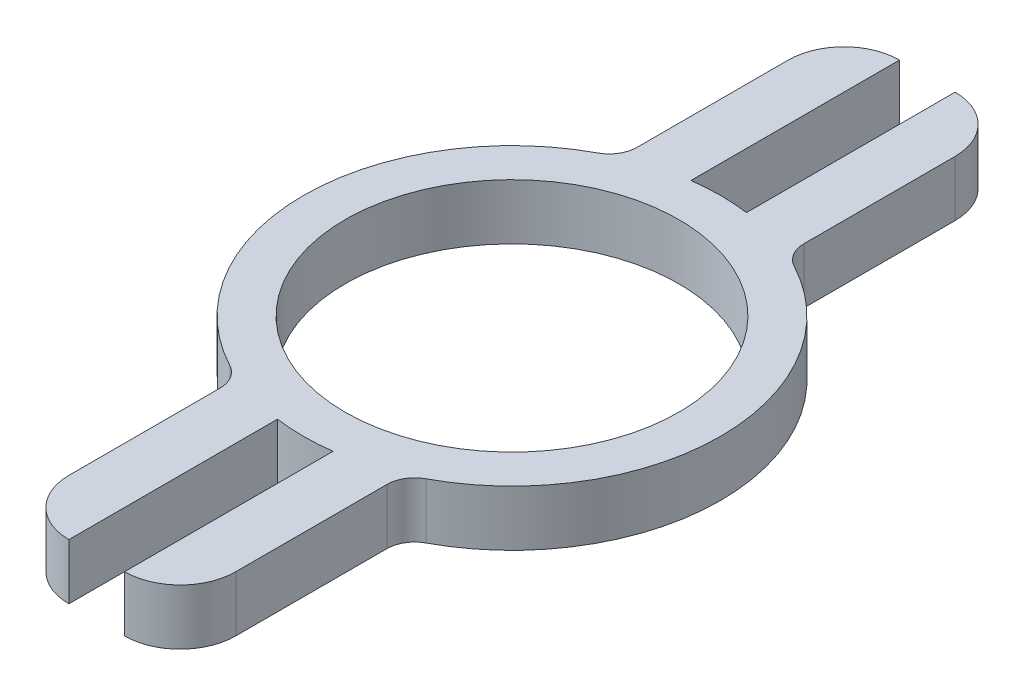
ISO-10303-21;
HEADER;
FILE_DESCRIPTION(('STEP AP214'),'2;1');
FILE_NAME('part.step','',(''),(''),'','','');
FILE_SCHEMA(('AUTOMOTIVE_DESIGN { 1 0 10303 214 1 1 1 1 }'));
ENDSEC;
DATA;
#1=APPLICATION_CONTEXT('core data for automotive mechanical design processes');
#2=APPLICATION_PROTOCOL_DEFINITION('international standard','automotive_design',2000,#1);
#3=PRODUCT_CONTEXT('',#1,'mechanical');
#4=PRODUCT('Part','Part','',(#3));
#5=PRODUCT_RELATED_PRODUCT_CATEGORY('part','',(#4));
#6=PRODUCT_DEFINITION_FORMATION('','',#4);
#7=PRODUCT_DEFINITION_CONTEXT('part definition',#1,'design');
#8=PRODUCT_DEFINITION('design','',#6,#7);
#9=PRODUCT_DEFINITION_SHAPE('','',#8);
#10=(LENGTH_UNIT() NAMED_UNIT(*) SI_UNIT(.MILLI.,.METRE.));
#11=(NAMED_UNIT(*) PLANE_ANGLE_UNIT() SI_UNIT($,.RADIAN.));
#12=(NAMED_UNIT(*) SI_UNIT($,.STERADIAN.) SOLID_ANGLE_UNIT());
#13=UNCERTAINTY_MEASURE_WITH_UNIT(LENGTH_MEASURE(1.E-05),#10,'distance_accuracy_value','');
#14=(GEOMETRIC_REPRESENTATION_CONTEXT(3) GLOBAL_UNCERTAINTY_ASSIGNED_CONTEXT((#13)) GLOBAL_UNIT_ASSIGNED_CONTEXT((#10,
#11,#12)) REPRESENTATION_CONTEXT('',''));
#15=CARTESIAN_POINT('',(0.,0.,0.));
#16=DIRECTION('',(0.,0.,1.));
#17=DIRECTION('',(1.,0.,0.));
#18=AXIS2_PLACEMENT_3D('',#15,#16,#17);
#19=CARTESIAN_POINT('',(-40.,20.,75.));
#20=DIRECTION('',(0.,-1.,0.));
#21=DIRECTION('',(0.,0.,-1.));
#22=AXIS2_PLACEMENT_3D('',#19,#20,#21);
#23=CYLINDRICAL_SURFACE('',#22,10.);
#24=DIRECTION('',(0.,-1.,0.));
#25=VECTOR('',#24,1.);
#26=CARTESIAN_POINT('',(-30.,-20.,75.));
#27=LINE('',#26,#25);
#28=CARTESIAN_POINT('',(-30.,0.,75.0000000000001));
#29=VERTEX_POINT('',#28);
#30=CARTESIAN_POINT('',(-30.,-20.,75.0000000000001));
#31=VERTEX_POINT('',#30);
#32=EDGE_CURVE('E365',#29,#31,#27,.T.);
#33=ORIENTED_EDGE('',*,*,#32,.F.);
#34=CARTESIAN_POINT('',(-40.,0.,75.));
#35=DIRECTION('',(0.,1.,0.));
#36=DIRECTION('',(0.,0.,1.));
#37=AXIS2_PLACEMENT_3D('',#34,#35,#36);
#38=CIRCLE('',#37,10.);
#39=CARTESIAN_POINT('',(-35.2941176470588,0.,66.1764705882353));
#40=VERTEX_POINT('',#39);
#41=EDGE_CURVE('E55',#29,#40,#38,.T.);
#42=ORIENTED_EDGE('',*,*,#41,.T.);
#43=DIRECTION('',(0.,-1.,0.));
#44=VECTOR('',#43,1.);
#45=CARTESIAN_POINT('',(-35.2941176470588,20.,66.1764705882353));
#46=LINE('',#45,#44);
#47=CARTESIAN_POINT('',(-35.2941176470589,-20.,66.1764705882353));
#48=VERTEX_POINT('',#47);
#49=EDGE_CURVE('E369',#48,#40,#46,.F.);
#50=ORIENTED_EDGE('',*,*,#49,.F.);
#51=CARTESIAN_POINT('',(-40.,-20.,75.));
#52=DIRECTION('',(0.,-1.,0.));
#53=DIRECTION('',(0.,0.,-1.));
#54=AXIS2_PLACEMENT_3D('',#51,#52,#53);
#55=CIRCLE('',#54,10.);
#56=EDGE_CURVE('E11',#48,#31,#55,.T.);
#57=ORIENTED_EDGE('',*,*,#56,.T.);
#58=EDGE_LOOP('',(#33,#42,#50,#57));
#59=FACE_BOUND('',#58,.T.);
#60=ADVANCED_FACE('F47',(#59),#23,.F.);
#61=CARTESIAN_POINT('',(40.,20.,75.));
#62=DIRECTION('',(0.,-1.,0.));
#63=DIRECTION('',(0.,0.,-1.));
#64=AXIS2_PLACEMENT_3D('',#61,#62,#63);
#65=CYLINDRICAL_SURFACE('',#64,10.);
#66=DIRECTION('',(0.,-1.,0.));
#67=VECTOR('',#66,1.);
#68=CARTESIAN_POINT('',(35.2941176470588,20.,66.1764705882353));
#69=LINE('',#68,#67);
#70=CARTESIAN_POINT('',(35.2941176470588,0.,66.1764705882353));
#71=VERTEX_POINT('',#70);
#72=CARTESIAN_POINT('',(35.2941176470588,-20.,66.1764705882353));
#73=VERTEX_POINT('',#72);
#74=EDGE_CURVE('E351',#71,#73,#69,.T.);
#75=ORIENTED_EDGE('',*,*,#74,.F.);
#76=CARTESIAN_POINT('',(40.,0.,75.));
#77=DIRECTION('',(0.,1.,0.));
#78=DIRECTION('',(0.,0.,1.));
#79=AXIS2_PLACEMENT_3D('',#76,#77,#78);
#80=CIRCLE('',#79,10.);
#81=CARTESIAN_POINT('',(30.,0.,75.0000000000001));
#82=VERTEX_POINT('',#81);
#83=EDGE_CURVE('E359',#71,#82,#80,.T.);
#84=ORIENTED_EDGE('',*,*,#83,.T.);
#85=DIRECTION('',(0.,1.,0.));
#86=VECTOR('',#85,1.);
#87=CARTESIAN_POINT('',(30.,20.,75.));
#88=LINE('',#87,#86);
#89=CARTESIAN_POINT('',(30.,-20.,75.0000000000001));
#90=VERTEX_POINT('',#89);
#91=EDGE_CURVE('E355',#90,#82,#88,.T.);
#92=ORIENTED_EDGE('',*,*,#91,.F.);
#93=CARTESIAN_POINT('',(40.,-20.,75.));
#94=DIRECTION('',(0.,-1.,0.));
#95=DIRECTION('',(0.,0.,-1.));
#96=AXIS2_PLACEMENT_3D('',#93,#94,#95);
#97=CIRCLE('',#96,10.);
#98=EDGE_CURVE('E362',#90,#73,#97,.T.);
#99=ORIENTED_EDGE('',*,*,#98,.T.);
#100=EDGE_LOOP('',(#75,#84,#92,#99));
#101=FACE_BOUND('',#100,.T.);
#102=ADVANCED_FACE('F428',(#101),#65,.F.);
#103=CARTESIAN_POINT('',(40.,20.,-75.));
#104=DIRECTION('',(0.,-1.,0.));
#105=DIRECTION('',(0.,0.,-1.));
#106=AXIS2_PLACEMENT_3D('',#103,#104,#105);
#107=CYLINDRICAL_SURFACE('',#106,10.);
#108=DIRECTION('',(0.,-1.,0.));
#109=VECTOR('',#108,1.);
#110=CARTESIAN_POINT('',(35.2941176470588,20.,-66.1764705882353));
#111=LINE('',#110,#109);
#112=CARTESIAN_POINT('',(35.2941176470588,-20.,-66.1764705882353));
#113=VERTEX_POINT('',#112);
#114=CARTESIAN_POINT('',(35.2941176470588,0.,-66.1764705882353));
#115=VERTEX_POINT('',#114);
#116=EDGE_CURVE('E336',#113,#115,#111,.F.);
#117=ORIENTED_EDGE('',*,*,#116,.F.);
#118=CARTESIAN_POINT('',(40.,-20.,-75.));
#119=DIRECTION('',(0.,-1.,0.));
#120=DIRECTION('',(0.,0.,-1.));
#121=AXIS2_PLACEMENT_3D('',#118,#119,#120);
#122=CIRCLE('',#121,10.);
#123=CARTESIAN_POINT('',(30.,-20.,-75.0000000000001));
#124=VERTEX_POINT('',#123);
#125=EDGE_CURVE('E344',#113,#124,#122,.T.);
#126=ORIENTED_EDGE('',*,*,#125,.T.);
#127=DIRECTION('',(0.,-1.,0.));
#128=VECTOR('',#127,1.);
#129=CARTESIAN_POINT('',(30.,-20.,-75.));
#130=LINE('',#129,#128);
#131=CARTESIAN_POINT('',(30.,0.,-75.0000000000001));
#132=VERTEX_POINT('',#131);
#133=EDGE_CURVE('E340',#132,#124,#130,.T.);
#134=ORIENTED_EDGE('',*,*,#133,.F.);
#135=CARTESIAN_POINT('',(40.,0.,-75.));
#136=DIRECTION('',(0.,1.,0.));
#137=DIRECTION('',(0.,0.,1.));
#138=AXIS2_PLACEMENT_3D('',#135,#136,#137);
#139=CIRCLE('',#138,10.);
#140=EDGE_CURVE('E347',#132,#115,#139,.T.);
#141=ORIENTED_EDGE('',*,*,#140,.T.);
#142=EDGE_LOOP('',(#117,#126,#134,#141));
#143=FACE_BOUND('',#142,.T.);
#144=ADVANCED_FACE('F434',(#143),#107,.F.);
#145=CARTESIAN_POINT('',(-40.,20.,-75.));
#146=DIRECTION('',(0.,-1.,0.));
#147=DIRECTION('',(0.,0.,-1.));
#148=AXIS2_PLACEMENT_3D('',#145,#146,#147);
#149=CYLINDRICAL_SURFACE('',#148,10.);
#150=DIRECTION('',(0.,-1.,0.));
#151=VECTOR('',#150,1.);
#152=CARTESIAN_POINT('',(-35.2941176470588,20.,-66.1764705882353));
#153=LINE('',#152,#151);
#154=CARTESIAN_POINT('',(-35.2941176470588,0.,-66.1764705882353));
#155=VERTEX_POINT('',#154);
#156=CARTESIAN_POINT('',(-35.2941176470588,-20.,-66.1764705882353));
#157=VERTEX_POINT('',#156);
#158=EDGE_CURVE('E318',#155,#157,#153,.T.);
#159=ORIENTED_EDGE('',*,*,#158,.F.);
#160=CARTESIAN_POINT('',(-40.,0.,-75.));
#161=DIRECTION('',(0.,1.,0.));
#162=DIRECTION('',(0.,0.,1.));
#163=AXIS2_PLACEMENT_3D('',#160,#161,#162);
#164=CIRCLE('',#163,10.);
#165=CARTESIAN_POINT('',(-30.,0.,-75.0000000000001));
#166=VERTEX_POINT('',#165);
#167=EDGE_CURVE('E329',#155,#166,#164,.T.);
#168=ORIENTED_EDGE('',*,*,#167,.T.);
#169=DIRECTION('',(0.,1.,0.));
#170=VECTOR('',#169,1.);
#171=CARTESIAN_POINT('',(-30.,20.,-75.));
#172=LINE('',#171,#170);
#173=CARTESIAN_POINT('',(-30.,-20.,-75.0000000000001));
#174=VERTEX_POINT('',#173);
#175=EDGE_CURVE('E325',#174,#166,#172,.T.);
#176=ORIENTED_EDGE('',*,*,#175,.F.);
#177=CARTESIAN_POINT('',(-40.,-20.,-75.));
#178=DIRECTION('',(0.,-1.,0.));
#179=DIRECTION('',(0.,0.,-1.));
#180=AXIS2_PLACEMENT_3D('',#177,#178,#179);
#181=CIRCLE('',#180,10.);
#182=EDGE_CURVE('E332',#174,#157,#181,.T.);
#183=ORIENTED_EDGE('',*,*,#182,.T.);
#184=EDGE_LOOP('',(#159,#168,#176,#183));
#185=FACE_BOUND('',#184,.T.);
#186=ADVANCED_FACE('F438',(#185),#149,.F.);
#187=CARTESIAN_POINT('',(0.,20.,0.));
#188=DIRECTION('',(0.,-1.,0.));
#189=DIRECTION('',(0.,0.,-1.));
#190=AXIS2_PLACEMENT_3D('',#187,#188,#189);
#191=CYLINDRICAL_SURFACE('',#190,75.);
#192=CARTESIAN_POINT('',(0.,0.,0.));
#193=DIRECTION('',(0.,1.,0.));
#194=DIRECTION('',(0.,0.,1.));
#195=AXIS2_PLACEMENT_3D('',#192,#193,#194);
#196=CIRCLE('',#195,75.);
#197=EDGE_CURVE('E197',#71,#115,#196,.T.);
#198=ORIENTED_EDGE('',*,*,#197,.F.);
#199=ORIENTED_EDGE('',*,*,#74,.T.);
#200=CARTESIAN_POINT('',(0.,-20.,0.));
#201=DIRECTION('',(0.,-1.,0.));
#202=DIRECTION('',(0.,0.,-1.));
#203=AXIS2_PLACEMENT_3D('',#200,#201,#202);
#204=CIRCLE('',#203,75.);
#205=EDGE_CURVE('E270',#113,#73,#204,.T.);
#206=ORIENTED_EDGE('',*,*,#205,.F.);
#207=ORIENTED_EDGE('',*,*,#116,.T.);
#208=EDGE_LOOP('',(#198,#199,#206,#207));
#209=FACE_BOUND('',#208,.T.);
#210=ADVANCED_FACE('F436',(#209),#191,.T.);
#211=CARTESIAN_POINT('',(10.,0.,-74.3303437365926));
#212=VERTEX_POINT('',#211);
#213=CARTESIAN_POINT('',(-10.,0.,-74.3303437365926));
#214=VERTEX_POINT('',#213);
#215=EDGE_CURVE('E198',#212,#214,#196,.T.);
#216=ORIENTED_EDGE('',*,*,#215,.F.);
#217=DIRECTION('',(0.,1.,0.));
#218=VECTOR('',#217,1.);
#219=CARTESIAN_POINT('',(10.,-20.,-74.3303437365926));
#220=LINE('',#219,#218);
#221=CARTESIAN_POINT('',(10.,-20.,-74.3303437365926));
#222=VERTEX_POINT('',#221);
#223=EDGE_CURVE('E262',#222,#212,#220,.T.);
#224=ORIENTED_EDGE('',*,*,#223,.F.);
#225=CARTESIAN_POINT('',(-10.,-20.,-74.3303437365926));
#226=VERTEX_POINT('',#225);
#227=EDGE_CURVE('E266',#226,#222,#204,.T.);
#228=ORIENTED_EDGE('',*,*,#227,.F.);
#229=DIRECTION('',(0.,1.,0.));
#230=VECTOR('',#229,1.);
#231=CARTESIAN_POINT('',(-10.,-20.,-74.3303437365926));
#232=LINE('',#231,#230);
#233=EDGE_CURVE('E234',#226,#214,#232,.T.);
#234=ORIENTED_EDGE('',*,*,#233,.T.);
#235=EDGE_LOOP('',(#216,#224,#228,#234));
#236=FACE_BOUND('',#235,.T.);
#237=ADVANCED_FACE('F386',(#236),#191,.T.);
#238=EDGE_CURVE('E275',#48,#157,#204,.T.);
#239=ORIENTED_EDGE('',*,*,#238,.F.);
#240=ORIENTED_EDGE('',*,*,#49,.T.);
#241=EDGE_CURVE('E194',#155,#40,#196,.T.);
#242=ORIENTED_EDGE('',*,*,#241,.F.);
#243=ORIENTED_EDGE('',*,*,#158,.T.);
#244=EDGE_LOOP('',(#239,#240,#242,#243));
#245=FACE_BOUND('',#244,.T.);
#246=ADVANCED_FACE('F445',(#245),#191,.T.);
#247=CARTESIAN_POINT('',(-10.,0.,74.3303437365926));
#248=VERTEX_POINT('',#247);
#249=CARTESIAN_POINT('',(10.,0.,74.3303437365926));
#250=VERTEX_POINT('',#249);
#251=EDGE_CURVE('E181',#248,#250,#196,.T.);
#252=ORIENTED_EDGE('',*,*,#251,.F.);
#253=DIRECTION('',(0.,1.,0.));
#254=VECTOR('',#253,1.);
#255=CARTESIAN_POINT('',(-10.,-20.,74.3303437365926));
#256=LINE('',#255,#254);
#257=CARTESIAN_POINT('',(-10.,-20.,74.3303437365926));
#258=VERTEX_POINT('',#257);
#259=EDGE_CURVE('E209',#258,#248,#256,.T.);
#260=ORIENTED_EDGE('',*,*,#259,.F.);
#261=CARTESIAN_POINT('',(10.,-20.,74.3303437365926));
#262=VERTEX_POINT('',#261);
#263=EDGE_CURVE('E214',#262,#258,#204,.T.);
#264=ORIENTED_EDGE('',*,*,#263,.F.);
#265=DIRECTION('',(0.,1.,0.));
#266=VECTOR('',#265,1.);
#267=CARTESIAN_POINT('',(10.,-20.,74.3303437365926));
#268=LINE('',#267,#266);
#269=EDGE_CURVE('E203',#262,#250,#268,.T.);
#270=ORIENTED_EDGE('',*,*,#269,.T.);
#271=EDGE_LOOP('',(#252,#260,#264,#270));
#272=FACE_BOUND('',#271,.T.);
#273=ADVANCED_FACE('F212',(#272),#191,.T.);
#274=CARTESIAN_POINT('',(0.,-20.,0.));
#275=DIRECTION('',(0.,1.,0.));
#276=DIRECTION('',(0.,0.,1.));
#277=AXIS2_PLACEMENT_3D('',#274,#275,#276);
#278=CYLINDRICAL_SURFACE('',#277,60.);
#279=CARTESIAN_POINT('',(0.,-20.,0.));
#280=DIRECTION('',(0.,1.,0.));
#281=DIRECTION('',(0.,0.,1.));
#282=AXIS2_PLACEMENT_3D('',#279,#280,#281);
#283=CIRCLE('',#282,60.);
#284=CARTESIAN_POINT('',(0.,-20.,60.));
#285=VERTEX_POINT('',#284);
#286=EDGE_CURVE('E391',#285,#285,#283,.T.);
#287=ORIENTED_EDGE('',*,*,#286,.F.);
#288=EDGE_LOOP('',(#287));
#289=FACE_BOUND('',#288,.T.);
#290=CARTESIAN_POINT('',(0.,0.,0.));
#291=DIRECTION('',(0.,1.,0.));
#292=DIRECTION('',(0.,0.,1.));
#293=AXIS2_PLACEMENT_3D('',#290,#291,#292);
#294=CIRCLE('',#293,60.);
#295=CARTESIAN_POINT('',(0.,0.,60.));
#296=VERTEX_POINT('',#295);
#297=EDGE_CURVE('E195',#296,#296,#294,.F.);
#298=ORIENTED_EDGE('',*,*,#297,.F.);
#299=EDGE_LOOP('',(#298));
#300=FACE_BOUND('',#299,.T.);
#301=ADVANCED_FACE('F452',(#289,#300),#278,.F.);
#302=CARTESIAN_POINT('',(10.,-20.,129.330343736593));
#303=DIRECTION('',(0.,-1.,0.));
#304=DIRECTION('',(0.,0.,-1.));
#305=AXIS2_PLACEMENT_3D('',#302,#303,#304);
#306=CYLINDRICAL_SURFACE('',#305,20.);
#307=DIRECTION('',(0.,-1.,0.));
#308=VECTOR('',#307,1.);
#309=CARTESIAN_POINT('',(30.,-20.,129.330343736593));
#310=LINE('',#309,#308);
#311=CARTESIAN_POINT('',(30.,0.,129.330343736593));
#312=VERTEX_POINT('',#311);
#313=CARTESIAN_POINT('',(30.,-20.,129.330343736593));
#314=VERTEX_POINT('',#313);
#315=EDGE_CURVE('E308',#312,#314,#310,.T.);
#316=ORIENTED_EDGE('',*,*,#315,.F.);
#317=CARTESIAN_POINT('',(10.,0.,129.330343736593));
#318=DIRECTION('',(0.,1.,0.));
#319=DIRECTION('',(0.,0.,1.));
#320=AXIS2_PLACEMENT_3D('',#317,#318,#319);
#321=CIRCLE('',#320,20.);
#322=CARTESIAN_POINT('',(10.,0.,149.330343736593));
#323=VERTEX_POINT('',#322);
#324=EDGE_CURVE('E312',#323,#312,#321,.T.);
#325=ORIENTED_EDGE('',*,*,#324,.F.);
#326=DIRECTION('',(0.,1.,0.));
#327=VECTOR('',#326,1.);
#328=CARTESIAN_POINT('',(10.,-20.,149.330343736593));
#329=LINE('',#328,#327);
#330=CARTESIAN_POINT('',(10.,-20.,149.330343736593));
#331=VERTEX_POINT('',#330);
#332=EDGE_CURVE('E206',#331,#323,#329,.T.);
#333=ORIENTED_EDGE('',*,*,#332,.F.);
#334=CARTESIAN_POINT('',(10.,-20.,129.330343736593));
#335=DIRECTION('',(0.,-1.,0.));
#336=DIRECTION('',(0.,0.,-1.));
#337=AXIS2_PLACEMENT_3D('',#334,#335,#336);
#338=CIRCLE('',#337,20.);
#339=EDGE_CURVE('E315',#314,#331,#338,.T.);
#340=ORIENTED_EDGE('',*,*,#339,.F.);
#341=EDGE_LOOP('',(#316,#325,#333,#340));
#342=FACE_BOUND('',#341,.T.);
#343=ADVANCED_FACE('F424',(#342),#306,.T.);
#344=CARTESIAN_POINT('',(-10.,-20.,129.330343736593));
#345=DIRECTION('',(0.,1.,0.));
#346=DIRECTION('',(0.,0.,1.));
#347=AXIS2_PLACEMENT_3D('',#344,#345,#346);
#348=CYLINDRICAL_SURFACE('',#347,20.);
#349=DIRECTION('',(0.,1.,0.));
#350=VECTOR('',#349,1.);
#351=CARTESIAN_POINT('',(-30.,-20.,129.330343736593));
#352=LINE('',#351,#350);
#353=CARTESIAN_POINT('',(-30.,-20.,129.330343736593));
#354=VERTEX_POINT('',#353);
#355=CARTESIAN_POINT('',(-30.,0.,129.330343736593));
#356=VERTEX_POINT('',#355);
#357=EDGE_CURVE('E297',#354,#356,#352,.T.);
#358=ORIENTED_EDGE('',*,*,#357,.F.);
#359=CARTESIAN_POINT('',(-10.,-20.,129.330343736593));
#360=DIRECTION('',(0.,-1.,0.));
#361=DIRECTION('',(0.,0.,-1.));
#362=AXIS2_PLACEMENT_3D('',#359,#360,#361);
#363=CIRCLE('',#362,20.);
#364=CARTESIAN_POINT('',(-10.,-20.,149.330343736593));
#365=VERTEX_POINT('',#364);
#366=EDGE_CURVE('E301',#365,#354,#363,.T.);
#367=ORIENTED_EDGE('',*,*,#366,.F.);
#368=DIRECTION('',(0.,1.,0.));
#369=VECTOR('',#368,1.);
#370=CARTESIAN_POINT('',(-10.,-20.,149.330343736593));
#371=LINE('',#370,#369);
#372=CARTESIAN_POINT('',(-10.,0.,149.330343736593));
#373=VERTEX_POINT('',#372);
#374=EDGE_CURVE('E404',#365,#373,#371,.T.);
#375=ORIENTED_EDGE('',*,*,#374,.T.);
#376=CARTESIAN_POINT('',(-10.,0.,129.330343736593));
#377=DIRECTION('',(0.,1.,0.));
#378=DIRECTION('',(0.,0.,1.));
#379=AXIS2_PLACEMENT_3D('',#376,#377,#378);
#380=CIRCLE('',#379,20.);
#381=EDGE_CURVE('E305',#356,#373,#380,.T.);
#382=ORIENTED_EDGE('',*,*,#381,.F.);
#383=EDGE_LOOP('',(#358,#367,#375,#382));
#384=FACE_BOUND('',#383,.T.);
#385=ADVANCED_FACE('F463',(#384),#348,.T.);
#386=CARTESIAN_POINT('',(-10.,-20.,-129.330343736593));
#387=DIRECTION('',(0.,-1.,0.));
#388=DIRECTION('',(0.,0.,-1.));
#389=AXIS2_PLACEMENT_3D('',#386,#387,#388);
#390=CYLINDRICAL_SURFACE('',#389,20.);
#391=DIRECTION('',(0.,-1.,0.));
#392=VECTOR('',#391,1.);
#393=CARTESIAN_POINT('',(-30.,-20.,-129.330343736593));
#394=LINE('',#393,#392);
#395=CARTESIAN_POINT('',(-30.,0.,-129.330343736593));
#396=VERTEX_POINT('',#395);
#397=CARTESIAN_POINT('',(-30.,-20.,-129.330343736593));
#398=VERTEX_POINT('',#397);
#399=EDGE_CURVE('E286',#396,#398,#394,.T.);
#400=ORIENTED_EDGE('',*,*,#399,.F.);
#401=CARTESIAN_POINT('',(-10.,0.,-129.330343736593));
#402=DIRECTION('',(0.,1.,0.));
#403=DIRECTION('',(0.,0.,1.));
#404=AXIS2_PLACEMENT_3D('',#401,#402,#403);
#405=CIRCLE('',#404,20.);
#406=CARTESIAN_POINT('',(-10.,0.,-149.330343736593));
#407=VERTEX_POINT('',#406);
#408=EDGE_CURVE('E290',#407,#396,#405,.T.);
#409=ORIENTED_EDGE('',*,*,#408,.F.);
#410=DIRECTION('',(0.,1.,0.));
#411=VECTOR('',#410,1.);
#412=CARTESIAN_POINT('',(-10.,-20.,-149.330343736593));
#413=LINE('',#412,#411);
#414=CARTESIAN_POINT('',(-10.,-20.,-149.330343736593));
#415=VERTEX_POINT('',#414);
#416=EDGE_CURVE('E240',#415,#407,#413,.T.);
#417=ORIENTED_EDGE('',*,*,#416,.F.);
#418=CARTESIAN_POINT('',(-10.,-20.,-129.330343736593));
#419=DIRECTION('',(0.,-1.,0.));
#420=DIRECTION('',(0.,0.,-1.));
#421=AXIS2_PLACEMENT_3D('',#418,#419,#420);
#422=CIRCLE('',#421,20.);
#423=EDGE_CURVE('E294',#398,#415,#422,.T.);
#424=ORIENTED_EDGE('',*,*,#423,.F.);
#425=EDGE_LOOP('',(#400,#409,#417,#424));
#426=FACE_BOUND('',#425,.T.);
#427=ADVANCED_FACE('F499',(#426),#390,.T.);
#428=CARTESIAN_POINT('',(10.,-20.,-129.330343736593));
#429=DIRECTION('',(0.,1.,0.));
#430=DIRECTION('',(0.,0.,1.));
#431=AXIS2_PLACEMENT_3D('',#428,#429,#430);
#432=CYLINDRICAL_SURFACE('',#431,20.);
#433=DIRECTION('',(0.,1.,0.));
#434=VECTOR('',#433,1.);
#435=CARTESIAN_POINT('',(30.,-20.,-129.330343736593));
#436=LINE('',#435,#434);
#437=CARTESIAN_POINT('',(30.,-20.,-129.330343736593));
#438=VERTEX_POINT('',#437);
#439=CARTESIAN_POINT('',(30.,0.,-129.330343736593));
#440=VERTEX_POINT('',#439);
#441=EDGE_CURVE('E274',#438,#440,#436,.T.);
#442=ORIENTED_EDGE('',*,*,#441,.F.);
#443=CARTESIAN_POINT('',(10.,-20.,-129.330343736593));
#444=DIRECTION('',(0.,-1.,0.));
#445=DIRECTION('',(0.,0.,-1.));
#446=AXIS2_PLACEMENT_3D('',#443,#444,#445);
#447=CIRCLE('',#446,20.);
#448=CARTESIAN_POINT('',(10.,-20.,-149.330343736593));
#449=VERTEX_POINT('',#448);
#450=EDGE_CURVE('E279',#449,#438,#447,.T.);
#451=ORIENTED_EDGE('',*,*,#450,.F.);
#452=DIRECTION('',(0.,1.,0.));
#453=VECTOR('',#452,1.);
#454=CARTESIAN_POINT('',(10.,-20.,-149.330343736593));
#455=LINE('',#454,#453);
#456=CARTESIAN_POINT('',(10.,0.,-149.330343736593));
#457=VERTEX_POINT('',#456);
#458=EDGE_CURVE('E256',#449,#457,#455,.T.);
#459=ORIENTED_EDGE('',*,*,#458,.T.);
#460=CARTESIAN_POINT('',(10.,0.,-129.330343736593));
#461=DIRECTION('',(0.,1.,0.));
#462=DIRECTION('',(0.,0.,1.));
#463=AXIS2_PLACEMENT_3D('',#460,#461,#462);
#464=CIRCLE('',#463,20.);
#465=EDGE_CURVE('E283',#440,#457,#464,.T.);
#466=ORIENTED_EDGE('',*,*,#465,.F.);
#467=EDGE_LOOP('',(#442,#451,#459,#466));
#468=FACE_BOUND('',#467,.T.);
#469=ADVANCED_FACE('F495',(#468),#432,.T.);
#470=CARTESIAN_POINT('',(0.,-20.,0.));
#471=DIRECTION('',(0.,-1.,0.));
#472=DIRECTION('',(0.,0.,-1.));
#473=AXIS2_PLACEMENT_3D('',#470,#471,#472);
#474=PLANE('',#473);
#475=ORIENTED_EDGE('',*,*,#56,.F.);
#476=ORIENTED_EDGE('',*,*,#238,.T.);
#477=ORIENTED_EDGE('',*,*,#182,.F.);
#478=DIRECTION('',(0.,0.,-1.));
#479=VECTOR('',#478,1.);
#480=CARTESIAN_POINT('',(-30.,-20.,-149.330343736593));
#481=LINE('',#480,#479);
#482=EDGE_CURVE('E230',#174,#398,#481,.T.);
#483=ORIENTED_EDGE('',*,*,#482,.T.);
#484=ORIENTED_EDGE('',*,*,#423,.T.);
#485=DIRECTION('',(0.,0.,1.));
#486=VECTOR('',#485,1.);
#487=CARTESIAN_POINT('',(-10.,-20.,-74.3303437365926));
#488=LINE('',#487,#486);
#489=EDGE_CURVE('E226',#415,#226,#488,.T.);
#490=ORIENTED_EDGE('',*,*,#489,.T.);
#491=ORIENTED_EDGE('',*,*,#227,.T.);
#492=DIRECTION('',(0.,0.,1.));
#493=VECTOR('',#492,1.);
#494=CARTESIAN_POINT('',(10.,-20.,-74.3303437365926));
#495=LINE('',#494,#493);
#496=EDGE_CURVE('E251',#449,#222,#495,.T.);
#497=ORIENTED_EDGE('',*,*,#496,.F.);
#498=ORIENTED_EDGE('',*,*,#450,.T.);
#499=DIRECTION('',(0.,0.,-1.));
#500=VECTOR('',#499,1.);
#501=CARTESIAN_POINT('',(30.,-20.,-149.330343736593));
#502=LINE('',#501,#500);
#503=EDGE_CURVE('E248',#124,#438,#502,.T.);
#504=ORIENTED_EDGE('',*,*,#503,.F.);
#505=ORIENTED_EDGE('',*,*,#125,.F.);
#506=ORIENTED_EDGE('',*,*,#205,.T.);
#507=ORIENTED_EDGE('',*,*,#98,.F.);
#508=DIRECTION('',(0.,0.,1.));
#509=VECTOR('',#508,1.);
#510=CARTESIAN_POINT('',(30.,-20.,149.330343736593));
#511=LINE('',#510,#509);
#512=EDGE_CURVE('E216',#90,#314,#511,.T.);
#513=ORIENTED_EDGE('',*,*,#512,.T.);
#514=ORIENTED_EDGE('',*,*,#339,.T.);
#515=DIRECTION('',(0.,0.,-1.));
#516=VECTOR('',#515,1.);
#517=CARTESIAN_POINT('',(10.,-20.,74.3303437365926));
#518=LINE('',#517,#516);
#519=EDGE_CURVE('E222',#331,#262,#518,.T.);
#520=ORIENTED_EDGE('',*,*,#519,.T.);
#521=ORIENTED_EDGE('',*,*,#263,.T.);
#522=DIRECTION('',(0.,0.,-1.));
#523=VECTOR('',#522,1.);
#524=CARTESIAN_POINT('',(-10.,-20.,74.3303437365926));
#525=LINE('',#524,#523);
#526=EDGE_CURVE('E401',#365,#258,#525,.T.);
#527=ORIENTED_EDGE('',*,*,#526,.F.);
#528=ORIENTED_EDGE('',*,*,#366,.T.);
#529=DIRECTION('',(0.,0.,1.));
#530=VECTOR('',#529,1.);
#531=CARTESIAN_POINT('',(-30.,-20.,149.330343736593));
#532=LINE('',#531,#530);
#533=EDGE_CURVE('E398',#31,#354,#532,.T.);
#534=ORIENTED_EDGE('',*,*,#533,.F.);
#535=EDGE_LOOP('',(#475,#476,#477,#483,#484,#490,#491,#497,#498,#504,#505,#506,#507,#513,#514,
#520,#521,#527,#528,#534));
#536=FACE_BOUND('',#535,.T.);
#537=ORIENTED_EDGE('',*,*,#286,.T.);
#538=EDGE_LOOP('',(#537));
#539=FACE_BOUND('',#538,.T.);
#540=ADVANCED_FACE('F377',(#536,#539),#474,.T.);
#541=CARTESIAN_POINT('',(10.,-20.,-74.3303437365926));
#542=DIRECTION('',(-1.,0.,0.));
#543=DIRECTION('',(0.,0.,1.));
#544=AXIS2_PLACEMENT_3D('',#541,#542,#543);
#545=PLANE('',#544);
#546=DIRECTION('',(0.,0.,1.));
#547=VECTOR('',#546,1.);
#548=CARTESIAN_POINT('',(10.,0.,-74.3303437365926));
#549=LINE('',#548,#547);
#550=EDGE_CURVE('E252',#457,#212,#549,.T.);
#551=ORIENTED_EDGE('',*,*,#550,.F.);
#552=ORIENTED_EDGE('',*,*,#458,.F.);
#553=ORIENTED_EDGE('',*,*,#496,.T.);
#554=ORIENTED_EDGE('',*,*,#223,.T.);
#555=EDGE_LOOP('',(#551,#552,#553,#554));
#556=FACE_BOUND('',#555,.T.);
#557=ADVANCED_FACE('F385',(#556),#545,.T.);
#558=CARTESIAN_POINT('',(30.,-20.,-149.330343736593));
#559=DIRECTION('',(1.,0.,0.));
#560=DIRECTION('',(0.,0.,-1.));
#561=AXIS2_PLACEMENT_3D('',#558,#559,#560);
#562=PLANE('',#561);
#563=DIRECTION('',(0.,0.,-1.));
#564=VECTOR('',#563,1.);
#565=CARTESIAN_POINT('',(30.,0.,-149.330343736593));
#566=LINE('',#565,#564);
#567=EDGE_CURVE('E244',#132,#440,#566,.T.);
#568=ORIENTED_EDGE('',*,*,#567,.F.);
#569=ORIENTED_EDGE('',*,*,#133,.T.);
#570=ORIENTED_EDGE('',*,*,#503,.T.);
#571=ORIENTED_EDGE('',*,*,#441,.T.);
#572=EDGE_LOOP('',(#568,#569,#570,#571));
#573=FACE_BOUND('',#572,.T.);
#574=ADVANCED_FACE('F489',(#573),#562,.T.);
#575=CARTESIAN_POINT('',(0.,0.,0.));
#576=DIRECTION('',(0.,1.,0.));
#577=DIRECTION('',(0.,0.,1.));
#578=AXIS2_PLACEMENT_3D('',#575,#576,#577);
#579=PLANE('',#578);
#580=ORIENTED_EDGE('',*,*,#41,.F.);
#581=DIRECTION('',(0.,0.,1.));
#582=VECTOR('',#581,1.);
#583=CARTESIAN_POINT('',(-30.,0.,149.330343736593));
#584=LINE('',#583,#582);
#585=EDGE_CURVE('E397',#29,#356,#584,.T.);
#586=ORIENTED_EDGE('',*,*,#585,.T.);
#587=ORIENTED_EDGE('',*,*,#381,.T.);
#588=DIRECTION('',(0.,0.,-1.));
#589=VECTOR('',#588,1.);
#590=CARTESIAN_POINT('',(-10.,0.,74.3303437365926));
#591=LINE('',#590,#589);
#592=EDGE_CURVE('E188',#373,#248,#591,.T.);
#593=ORIENTED_EDGE('',*,*,#592,.T.);
#594=ORIENTED_EDGE('',*,*,#251,.T.);
#595=DIRECTION('',(0.,0.,-1.));
#596=VECTOR('',#595,1.);
#597=CARTESIAN_POINT('',(10.,0.,74.3303437365926));
#598=LINE('',#597,#596);
#599=EDGE_CURVE('E186',#323,#250,#598,.T.);
#600=ORIENTED_EDGE('',*,*,#599,.F.);
#601=ORIENTED_EDGE('',*,*,#324,.T.);
#602=DIRECTION('',(0.,0.,1.));
#603=VECTOR('',#602,1.);
#604=CARTESIAN_POINT('',(30.,0.,149.330343736593));
#605=LINE('',#604,#603);
#606=EDGE_CURVE('E208',#82,#312,#605,.T.);
#607=ORIENTED_EDGE('',*,*,#606,.F.);
#608=ORIENTED_EDGE('',*,*,#83,.F.);
#609=ORIENTED_EDGE('',*,*,#197,.T.);
#610=ORIENTED_EDGE('',*,*,#140,.F.);
#611=ORIENTED_EDGE('',*,*,#567,.T.);
#612=ORIENTED_EDGE('',*,*,#465,.T.);
#613=ORIENTED_EDGE('',*,*,#550,.T.);
#614=ORIENTED_EDGE('',*,*,#215,.T.);
#615=DIRECTION('',(0.,0.,1.));
#616=VECTOR('',#615,1.);
#617=CARTESIAN_POINT('',(-10.,0.,-74.3303437365926));
#618=LINE('',#617,#616);
#619=EDGE_CURVE('E220',#407,#214,#618,.T.);
#620=ORIENTED_EDGE('',*,*,#619,.F.);
#621=ORIENTED_EDGE('',*,*,#408,.T.);
#622=DIRECTION('',(0.,0.,-1.));
#623=VECTOR('',#622,1.);
#624=CARTESIAN_POINT('',(-30.,0.,-149.330343736593));
#625=LINE('',#624,#623);
#626=EDGE_CURVE('E231',#166,#396,#625,.T.);
#627=ORIENTED_EDGE('',*,*,#626,.F.);
#628=ORIENTED_EDGE('',*,*,#167,.F.);
#629=ORIENTED_EDGE('',*,*,#241,.T.);
#630=EDGE_LOOP('',(#580,#586,#587,#593,#594,#600,#601,#607,#608,#609,#610,#611,#612,#613,#614,
#620,#621,#627,#628,#629));
#631=FACE_BOUND('',#630,.T.);
#632=ORIENTED_EDGE('',*,*,#297,.T.);
#633=EDGE_LOOP('',(#632));
#634=FACE_BOUND('',#633,.T.);
#635=ADVANCED_FACE('F183',(#631,#634),#579,.T.);
#636=CARTESIAN_POINT('',(-30.,-20.,-149.330343736593));
#637=DIRECTION('',(1.,0.,0.));
#638=DIRECTION('',(0.,0.,-1.));
#639=AXIS2_PLACEMENT_3D('',#636,#637,#638);
#640=PLANE('',#639);
#641=ORIENTED_EDGE('',*,*,#482,.F.);
#642=ORIENTED_EDGE('',*,*,#175,.T.);
#643=ORIENTED_EDGE('',*,*,#626,.T.);
#644=ORIENTED_EDGE('',*,*,#399,.T.);
#645=EDGE_LOOP('',(#641,#642,#643,#644));
#646=FACE_BOUND('',#645,.T.);
#647=ADVANCED_FACE('F480',(#646),#640,.F.);
#648=CARTESIAN_POINT('',(-10.,-20.,-74.3303437365926));
#649=DIRECTION('',(-1.,0.,0.));
#650=DIRECTION('',(0.,0.,1.));
#651=AXIS2_PLACEMENT_3D('',#648,#649,#650);
#652=PLANE('',#651);
#653=ORIENTED_EDGE('',*,*,#619,.T.);
#654=ORIENTED_EDGE('',*,*,#233,.F.);
#655=ORIENTED_EDGE('',*,*,#489,.F.);
#656=ORIENTED_EDGE('',*,*,#416,.T.);
#657=EDGE_LOOP('',(#653,#654,#655,#656));
#658=FACE_BOUND('',#657,.T.);
#659=ADVANCED_FACE('F478',(#658),#652,.F.);
#660=CARTESIAN_POINT('',(30.,-20.,149.330343736593));
#661=DIRECTION('',(-1.,0.,0.));
#662=DIRECTION('',(0.,0.,1.));
#663=AXIS2_PLACEMENT_3D('',#660,#661,#662);
#664=PLANE('',#663);
#665=ORIENTED_EDGE('',*,*,#512,.F.);
#666=ORIENTED_EDGE('',*,*,#91,.T.);
#667=ORIENTED_EDGE('',*,*,#606,.T.);
#668=ORIENTED_EDGE('',*,*,#315,.T.);
#669=EDGE_LOOP('',(#665,#666,#667,#668));
#670=FACE_BOUND('',#669,.T.);
#671=ADVANCED_FACE('F419',(#670),#664,.F.);
#672=CARTESIAN_POINT('',(10.,-20.,74.3303437365926));
#673=DIRECTION('',(1.,0.,0.));
#674=DIRECTION('',(0.,0.,-1.));
#675=AXIS2_PLACEMENT_3D('',#672,#673,#674);
#676=PLANE('',#675);
#677=ORIENTED_EDGE('',*,*,#599,.T.);
#678=ORIENTED_EDGE('',*,*,#269,.F.);
#679=ORIENTED_EDGE('',*,*,#519,.F.);
#680=ORIENTED_EDGE('',*,*,#332,.T.);
#681=EDGE_LOOP('',(#677,#678,#679,#680));
#682=FACE_BOUND('',#681,.T.);
#683=ADVANCED_FACE('F201',(#682),#676,.F.);
#684=CARTESIAN_POINT('',(-10.,-20.,74.3303437365926));
#685=DIRECTION('',(1.,0.,0.));
#686=DIRECTION('',(0.,0.,-1.));
#687=AXIS2_PLACEMENT_3D('',#684,#685,#686);
#688=PLANE('',#687);
#689=ORIENTED_EDGE('',*,*,#592,.F.);
#690=ORIENTED_EDGE('',*,*,#374,.F.);
#691=ORIENTED_EDGE('',*,*,#526,.T.);
#692=ORIENTED_EDGE('',*,*,#259,.T.);
#693=EDGE_LOOP('',(#689,#690,#691,#692));
#694=FACE_BOUND('',#693,.T.);
#695=ADVANCED_FACE('F467',(#694),#688,.T.);
#696=CARTESIAN_POINT('',(-30.,-20.,149.330343736593));
#697=DIRECTION('',(-1.,0.,0.));
#698=DIRECTION('',(0.,0.,1.));
#699=AXIS2_PLACEMENT_3D('',#696,#697,#698);
#700=PLANE('',#699);
#701=ORIENTED_EDGE('',*,*,#585,.F.);
#702=ORIENTED_EDGE('',*,*,#32,.T.);
#703=ORIENTED_EDGE('',*,*,#533,.T.);
#704=ORIENTED_EDGE('',*,*,#357,.T.);
#705=EDGE_LOOP('',(#701,#702,#703,#704));
#706=FACE_BOUND('',#705,.T.);
#707=ADVANCED_FACE('F459',(#706),#700,.T.);
#708=CLOSED_SHELL('',(#60,#102,#144,#186,#210,#237,#246,#273,#301,#343,#385,#427,#469,#540,#557,
#574,#635,#647,#659,#671,#683,#695,#707));
#709=MANIFOLD_SOLID_BREP('B2',#708);
#710=ADVANCED_BREP_SHAPE_REPRESENTATION('',(#18,#709),#14);
#711=SHAPE_DEFINITION_REPRESENTATION(#9,#710);
ENDSEC;
END-ISO-10303-21;
